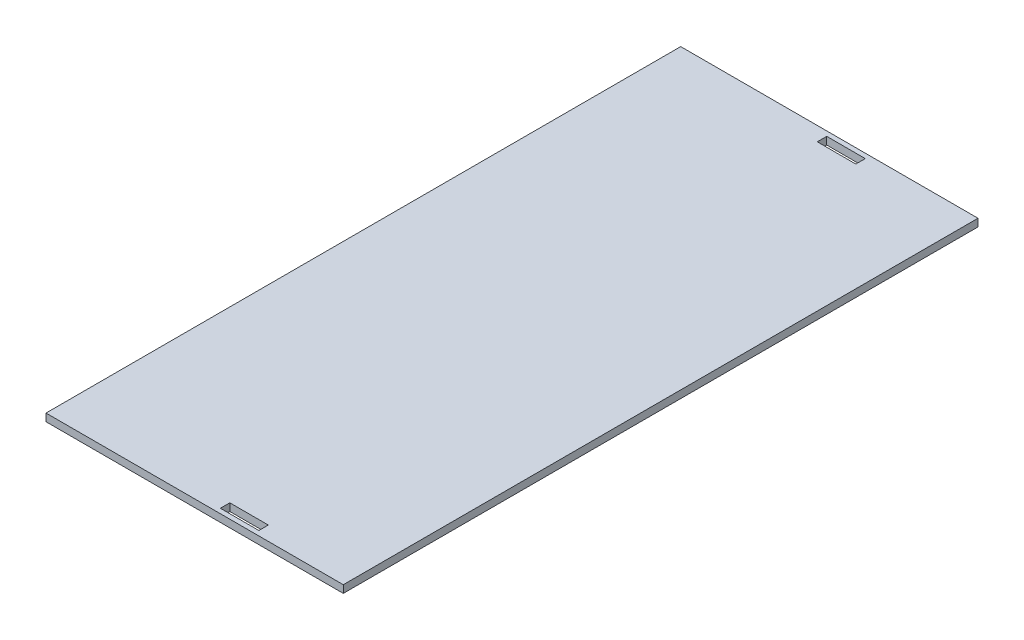
ISO-10303-21;
HEADER;
FILE_DESCRIPTION(('STEP AP214'),'2;1');
FILE_NAME('part.step','',(''),(''),'','','');
FILE_SCHEMA(('AUTOMOTIVE_DESIGN { 1 0 10303 214 1 1 1 1 }'));
ENDSEC;
DATA;
#1=APPLICATION_CONTEXT('core data for automotive mechanical design processes');
#2=APPLICATION_PROTOCOL_DEFINITION('international standard','automotive_design',2000,#1);
#3=PRODUCT_CONTEXT('',#1,'mechanical');
#4=PRODUCT('Part','Part','',(#3));
#5=PRODUCT_RELATED_PRODUCT_CATEGORY('part','',(#4));
#6=PRODUCT_DEFINITION_FORMATION('','',#4);
#7=PRODUCT_DEFINITION_CONTEXT('part definition',#1,'design');
#8=PRODUCT_DEFINITION('design','',#6,#7);
#9=PRODUCT_DEFINITION_SHAPE('','',#8);
#10=(LENGTH_UNIT() NAMED_UNIT(*) SI_UNIT(.MILLI.,.METRE.));
#11=(NAMED_UNIT(*) PLANE_ANGLE_UNIT() SI_UNIT($,.RADIAN.));
#12=(NAMED_UNIT(*) SI_UNIT($,.STERADIAN.) SOLID_ANGLE_UNIT());
#13=UNCERTAINTY_MEASURE_WITH_UNIT(LENGTH_MEASURE(1.E-05),#10,'distance_accuracy_value','');
#14=(GEOMETRIC_REPRESENTATION_CONTEXT(3) GLOBAL_UNCERTAINTY_ASSIGNED_CONTEXT((#13)) GLOBAL_UNIT_ASSIGNED_CONTEXT((#10,
#11,#12)) REPRESENTATION_CONTEXT('',''));
#15=CARTESIAN_POINT('',(0.,0.,0.));
#16=DIRECTION('',(0.,0.,1.));
#17=DIRECTION('',(1.,0.,0.));
#18=AXIS2_PLACEMENT_3D('',#15,#16,#17);
#19=CARTESIAN_POINT('',(39.345,2.,-84.));
#20=DIRECTION('',(-1.,0.,0.));
#21=DIRECTION('',(0.,0.,1.));
#22=AXIS2_PLACEMENT_3D('',#19,#20,#21);
#23=PLANE('',#22);
#24=DIRECTION('',(0.,0.,-1.));
#25=VECTOR('',#24,1.);
#26=CARTESIAN_POINT('',(39.345,0.,-84.));
#27=LINE('',#26,#25);
#28=CARTESIAN_POINT('',(39.345,0.,84.));
#29=VERTEX_POINT('',#28);
#30=CARTESIAN_POINT('',(39.345,0.,-84.));
#31=VERTEX_POINT('',#30);
#32=EDGE_CURVE('E195',#29,#31,#27,.T.);
#33=ORIENTED_EDGE('',*,*,#32,.T.);
#34=DIRECTION('',(0.,-1.,0.));
#35=VECTOR('',#34,1.);
#36=CARTESIAN_POINT('',(39.345,2.,-84.));
#37=LINE('',#36,#35);
#38=CARTESIAN_POINT('',(39.345,2.,-84.));
#39=VERTEX_POINT('',#38);
#40=EDGE_CURVE('E242',#39,#31,#37,.T.);
#41=ORIENTED_EDGE('',*,*,#40,.F.);
#42=DIRECTION('',(0.,0.,-1.));
#43=VECTOR('',#42,1.);
#44=CARTESIAN_POINT('',(39.345,2.,-84.));
#45=LINE('',#44,#43);
#46=CARTESIAN_POINT('',(39.345,2.,84.));
#47=VERTEX_POINT('',#46);
#48=EDGE_CURVE('E205',#47,#39,#45,.T.);
#49=ORIENTED_EDGE('',*,*,#48,.F.);
#50=DIRECTION('',(0.,-1.,0.));
#51=VECTOR('',#50,1.);
#52=CARTESIAN_POINT('',(39.345,2.,84.));
#53=LINE('',#52,#51);
#54=EDGE_CURVE('E219',#47,#29,#53,.T.);
#55=ORIENTED_EDGE('',*,*,#54,.T.);
#56=EDGE_LOOP('',(#33,#41,#49,#55));
#57=FACE_BOUND('',#56,.T.);
#58=ADVANCED_FACE('F39',(#57),#23,.F.);
#59=CARTESIAN_POINT('',(-39.345,2.,-84.));
#60=DIRECTION('',(0.,0.,1.));
#61=DIRECTION('',(1.,0.,0.));
#62=AXIS2_PLACEMENT_3D('',#59,#60,#61);
#63=PLANE('',#62);
#64=DIRECTION('',(-1.,0.,0.));
#65=VECTOR('',#64,1.);
#66=CARTESIAN_POINT('',(-39.345,0.,-84.));
#67=LINE('',#66,#65);
#68=CARTESIAN_POINT('',(-39.345,0.,-84.));
#69=VERTEX_POINT('',#68);
#70=EDGE_CURVE('E223',#31,#69,#67,.T.);
#71=ORIENTED_EDGE('',*,*,#70,.T.);
#72=DIRECTION('',(0.,-1.,0.));
#73=VECTOR('',#72,1.);
#74=CARTESIAN_POINT('',(-39.345,2.,-84.));
#75=LINE('',#74,#73);
#76=CARTESIAN_POINT('',(-39.345,2.,-84.));
#77=VERTEX_POINT('',#76);
#78=EDGE_CURVE('E238',#77,#69,#75,.T.);
#79=ORIENTED_EDGE('',*,*,#78,.F.);
#80=DIRECTION('',(-1.,0.,0.));
#81=VECTOR('',#80,1.);
#82=CARTESIAN_POINT('',(-39.345,2.,-84.));
#83=LINE('',#82,#81);
#84=EDGE_CURVE('E209',#39,#77,#83,.T.);
#85=ORIENTED_EDGE('',*,*,#84,.F.);
#86=ORIENTED_EDGE('',*,*,#40,.T.);
#87=EDGE_LOOP('',(#71,#79,#85,#86));
#88=FACE_BOUND('',#87,.T.);
#89=ADVANCED_FACE('F286',(#88),#63,.F.);
#90=CARTESIAN_POINT('',(-39.345,2.,-84.));
#91=DIRECTION('',(1.,0.,0.));
#92=DIRECTION('',(0.,0.,-1.));
#93=AXIS2_PLACEMENT_3D('',#90,#91,#92);
#94=PLANE('',#93);
#95=DIRECTION('',(0.,0.,1.));
#96=VECTOR('',#95,1.);
#97=CARTESIAN_POINT('',(-39.345,0.,-84.));
#98=LINE('',#97,#96);
#99=CARTESIAN_POINT('',(-39.345,0.,84.));
#100=VERTEX_POINT('',#99);
#101=EDGE_CURVE('E226',#69,#100,#98,.T.);
#102=ORIENTED_EDGE('',*,*,#101,.T.);
#103=DIRECTION('',(0.,-1.,0.));
#104=VECTOR('',#103,1.);
#105=CARTESIAN_POINT('',(-39.345,2.,84.));
#106=LINE('',#105,#104);
#107=CARTESIAN_POINT('',(-39.345,2.,84.));
#108=VERTEX_POINT('',#107);
#109=EDGE_CURVE('E234',#108,#100,#106,.T.);
#110=ORIENTED_EDGE('',*,*,#109,.F.);
#111=DIRECTION('',(0.,0.,1.));
#112=VECTOR('',#111,1.);
#113=CARTESIAN_POINT('',(-39.345,2.,-84.));
#114=LINE('',#113,#112);
#115=EDGE_CURVE('E213',#77,#108,#114,.T.);
#116=ORIENTED_EDGE('',*,*,#115,.F.);
#117=ORIENTED_EDGE('',*,*,#78,.T.);
#118=EDGE_LOOP('',(#102,#110,#116,#117));
#119=FACE_BOUND('',#118,.T.);
#120=ADVANCED_FACE('F291',(#119),#94,.F.);
#121=CARTESIAN_POINT('',(-39.345,2.,84.));
#122=DIRECTION('',(0.,0.,-1.));
#123=DIRECTION('',(-1.,0.,0.));
#124=AXIS2_PLACEMENT_3D('',#121,#122,#123);
#125=PLANE('',#124);
#126=DIRECTION('',(1.,0.,0.));
#127=VECTOR('',#126,1.);
#128=CARTESIAN_POINT('',(-39.345,0.,84.));
#129=LINE('',#128,#127);
#130=EDGE_CURVE('E210',#100,#29,#129,.T.);
#131=ORIENTED_EDGE('',*,*,#130,.T.);
#132=ORIENTED_EDGE('',*,*,#54,.F.);
#133=DIRECTION('',(1.,0.,0.));
#134=VECTOR('',#133,1.);
#135=CARTESIAN_POINT('',(-39.345,2.,84.));
#136=LINE('',#135,#134);
#137=EDGE_CURVE('E216',#108,#47,#136,.T.);
#138=ORIENTED_EDGE('',*,*,#137,.F.);
#139=ORIENTED_EDGE('',*,*,#109,.T.);
#140=EDGE_LOOP('',(#131,#132,#138,#139));
#141=FACE_BOUND('',#140,.T.);
#142=ADVANCED_FACE('F304',(#141),#125,.F.);
#143=CARTESIAN_POINT('',(0.,2.,0.));
#144=DIRECTION('',(0.,1.,0.));
#145=DIRECTION('',(0.,0.,1.));
#146=AXIS2_PLACEMENT_3D('',#143,#144,#145);
#147=PLANE('',#146);
#148=DIRECTION('',(0.,0.,1.));
#149=VECTOR('',#148,1.);
#150=CARTESIAN_POINT('',(5.55116,2.,82.75));
#151=LINE('',#150,#149);
#152=CARTESIAN_POINT('',(5.55116,2.,80.25));
#153=VERTEX_POINT('',#152);
#154=CARTESIAN_POINT('',(5.55116,2.,82.75));
#155=VERTEX_POINT('',#154);
#156=EDGE_CURVE('E54',#153,#155,#151,.T.);
#157=ORIENTED_EDGE('',*,*,#156,.F.);
#158=DIRECTION('',(-1.,0.,0.));
#159=VECTOR('',#158,1.);
#160=CARTESIAN_POINT('',(5.55116,2.,80.25));
#161=LINE('',#160,#159);
#162=CARTESIAN_POINT('',(15.75116,2.,80.25));
#163=VERTEX_POINT('',#162);
#164=EDGE_CURVE('E149',#163,#153,#161,.T.);
#165=ORIENTED_EDGE('',*,*,#164,.F.);
#166=DIRECTION('',(0.,0.,-1.));
#167=VECTOR('',#166,1.);
#168=CARTESIAN_POINT('',(15.75116,2.,82.75));
#169=LINE('',#168,#167);
#170=CARTESIAN_POINT('',(15.75116,2.,82.75));
#171=VERTEX_POINT('',#170);
#172=EDGE_CURVE('E153',#171,#163,#169,.T.);
#173=ORIENTED_EDGE('',*,*,#172,.F.);
#174=DIRECTION('',(1.,0.,0.));
#175=VECTOR('',#174,1.);
#176=CARTESIAN_POINT('',(5.55116,2.,82.75));
#177=LINE('',#176,#175);
#178=EDGE_CURVE('E162',#155,#171,#177,.T.);
#179=ORIENTED_EDGE('',*,*,#178,.F.);
#180=EDGE_LOOP('',(#157,#165,#173,#179));
#181=FACE_BOUND('',#180,.T.);
#182=DIRECTION('',(0.,0.,1.));
#183=VECTOR('',#182,1.);
#184=CARTESIAN_POINT('',(0.554999999999993,2.,-82.75));
#185=LINE('',#184,#183);
#186=CARTESIAN_POINT('',(0.554999999999993,2.,-82.75));
#187=VERTEX_POINT('',#186);
#188=CARTESIAN_POINT('',(0.554999999999993,2.,-80.25));
#189=VERTEX_POINT('',#188);
#190=EDGE_CURVE('E171',#187,#189,#185,.T.);
#191=ORIENTED_EDGE('',*,*,#190,.F.);
#192=DIRECTION('',(-1.,0.,0.));
#193=VECTOR('',#192,1.);
#194=CARTESIAN_POINT('',(10.755,2.,-82.75));
#195=LINE('',#194,#193);
#196=CARTESIAN_POINT('',(10.755,2.,-82.75));
#197=VERTEX_POINT('',#196);
#198=EDGE_CURVE('E187',#197,#187,#195,.T.);
#199=ORIENTED_EDGE('',*,*,#198,.F.);
#200=DIRECTION('',(0.,0.,-1.));
#201=VECTOR('',#200,1.);
#202=CARTESIAN_POINT('',(10.755,2.,-82.75));
#203=LINE('',#202,#201);
#204=CARTESIAN_POINT('',(10.755,2.,-80.25));
#205=VERTEX_POINT('',#204);
#206=EDGE_CURVE('E183',#205,#197,#203,.T.);
#207=ORIENTED_EDGE('',*,*,#206,.F.);
#208=DIRECTION('',(1.,0.,0.));
#209=VECTOR('',#208,1.);
#210=CARTESIAN_POINT('',(10.755,2.,-80.25));
#211=LINE('',#210,#209);
#212=EDGE_CURVE('E179',#189,#205,#211,.T.);
#213=ORIENTED_EDGE('',*,*,#212,.F.);
#214=EDGE_LOOP('',(#191,#199,#207,#213));
#215=FACE_BOUND('',#214,.T.);
#216=ORIENTED_EDGE('',*,*,#48,.T.);
#217=ORIENTED_EDGE('',*,*,#84,.T.);
#218=ORIENTED_EDGE('',*,*,#115,.T.);
#219=ORIENTED_EDGE('',*,*,#137,.T.);
#220=EDGE_LOOP('',(#216,#217,#218,#219));
#221=FACE_BOUND('',#220,.T.);
#222=ADVANCED_FACE('F268',(#181,#215,#221),#147,.T.);
#223=CARTESIAN_POINT('',(0.,0.,0.));
#224=DIRECTION('',(0.,1.,0.));
#225=DIRECTION('',(0.,0.,1.));
#226=AXIS2_PLACEMENT_3D('',#223,#224,#225);
#227=PLANE('',#226);
#228=DIRECTION('',(-1.,0.,0.));
#229=VECTOR('',#228,1.);
#230=CARTESIAN_POINT('',(5.55116,0.,80.25));
#231=LINE('',#230,#229);
#232=CARTESIAN_POINT('',(15.75116,0.,80.25));
#233=VERTEX_POINT('',#232);
#234=CARTESIAN_POINT('',(5.55116,0.,80.25));
#235=VERTEX_POINT('',#234);
#236=EDGE_CURVE('E137',#233,#235,#231,.T.);
#237=ORIENTED_EDGE('',*,*,#236,.T.);
#238=DIRECTION('',(0.,0.,1.));
#239=VECTOR('',#238,1.);
#240=CARTESIAN_POINT('',(5.55116,0.,82.75));
#241=LINE('',#240,#239);
#242=CARTESIAN_POINT('',(5.55116,0.,82.75));
#243=VERTEX_POINT('',#242);
#244=EDGE_CURVE('E130',#235,#243,#241,.T.);
#245=ORIENTED_EDGE('',*,*,#244,.T.);
#246=DIRECTION('',(1.,0.,0.));
#247=VECTOR('',#246,1.);
#248=CARTESIAN_POINT('',(5.55116,0.,82.75));
#249=LINE('',#248,#247);
#250=CARTESIAN_POINT('',(15.75116,0.,82.75));
#251=VERTEX_POINT('',#250);
#252=EDGE_CURVE('E140',#243,#251,#249,.T.);
#253=ORIENTED_EDGE('',*,*,#252,.T.);
#254=DIRECTION('',(0.,0.,-1.));
#255=VECTOR('',#254,1.);
#256=CARTESIAN_POINT('',(15.75116,0.,82.75));
#257=LINE('',#256,#255);
#258=EDGE_CURVE('E62',#251,#233,#257,.T.);
#259=ORIENTED_EDGE('',*,*,#258,.T.);
#260=EDGE_LOOP('',(#237,#245,#253,#259));
#261=FACE_BOUND('',#260,.T.);
#262=DIRECTION('',(-1.,0.,0.));
#263=VECTOR('',#262,1.);
#264=CARTESIAN_POINT('',(0.,0.,-82.75));
#265=LINE('',#264,#263);
#266=CARTESIAN_POINT('',(10.755,0.,-82.75));
#267=VERTEX_POINT('',#266);
#268=CARTESIAN_POINT('',(0.554999999999993,0.,-82.75));
#269=VERTEX_POINT('',#268);
#270=EDGE_CURVE('E47',#267,#269,#265,.T.);
#271=ORIENTED_EDGE('',*,*,#270,.T.);
#272=DIRECTION('',(0.,0.,1.));
#273=VECTOR('',#272,1.);
#274=CARTESIAN_POINT('',(0.555000000000007,0.,0.));
#275=LINE('',#274,#273);
#276=CARTESIAN_POINT('',(0.554999999999993,0.,-80.25));
#277=VERTEX_POINT('',#276);
#278=EDGE_CURVE('E11',#269,#277,#275,.T.);
#279=ORIENTED_EDGE('',*,*,#278,.T.);
#280=DIRECTION('',(1.,0.,0.));
#281=VECTOR('',#280,1.);
#282=CARTESIAN_POINT('',(0.,0.,-80.25));
#283=LINE('',#282,#281);
#284=CARTESIAN_POINT('',(10.755,0.,-80.25));
#285=VERTEX_POINT('',#284);
#286=EDGE_CURVE('E246',#277,#285,#283,.T.);
#287=ORIENTED_EDGE('',*,*,#286,.T.);
#288=DIRECTION('',(0.,0.,-1.));
#289=VECTOR('',#288,1.);
#290=CARTESIAN_POINT('',(10.755,0.,0.));
#291=LINE('',#290,#289);
#292=EDGE_CURVE('E250',#285,#267,#291,.T.);
#293=ORIENTED_EDGE('',*,*,#292,.T.);
#294=EDGE_LOOP('',(#271,#279,#287,#293));
#295=FACE_BOUND('',#294,.T.);
#296=ORIENTED_EDGE('',*,*,#32,.F.);
#297=ORIENTED_EDGE('',*,*,#130,.F.);
#298=ORIENTED_EDGE('',*,*,#101,.F.);
#299=ORIENTED_EDGE('',*,*,#70,.F.);
#300=EDGE_LOOP('',(#296,#297,#298,#299));
#301=FACE_BOUND('',#300,.T.);
#302=ADVANCED_FACE('F145',(#261,#295,#301),#227,.F.);
#303=CARTESIAN_POINT('',(0.554999999999993,-3.,-82.75));
#304=DIRECTION('',(-1.,0.,0.));
#305=DIRECTION('',(0.,0.,1.));
#306=AXIS2_PLACEMENT_3D('',#303,#304,#305);
#307=PLANE('',#306);
#308=DIRECTION('',(0.,1.,0.));
#309=VECTOR('',#308,1.);
#310=CARTESIAN_POINT('',(0.554999999999993,-3.,-82.75));
#311=LINE('',#310,#309);
#312=EDGE_CURVE('E192',#269,#187,#311,.T.);
#313=ORIENTED_EDGE('',*,*,#312,.T.);
#314=ORIENTED_EDGE('',*,*,#190,.T.);
#315=DIRECTION('',(0.,1.,0.));
#316=VECTOR('',#315,1.);
#317=CARTESIAN_POINT('',(0.554999999999993,-3.,-80.25));
#318=LINE('',#317,#316);
#319=EDGE_CURVE('E191',#277,#189,#318,.T.);
#320=ORIENTED_EDGE('',*,*,#319,.F.);
#321=ORIENTED_EDGE('',*,*,#278,.F.);
#322=EDGE_LOOP('',(#313,#314,#320,#321));
#323=FACE_BOUND('',#322,.T.);
#324=ADVANCED_FACE('F272',(#323),#307,.F.);
#325=CARTESIAN_POINT('',(10.755,-3.,-82.75));
#326=DIRECTION('',(0.,0.,-1.));
#327=DIRECTION('',(-1.,0.,0.));
#328=AXIS2_PLACEMENT_3D('',#325,#326,#327);
#329=PLANE('',#328);
#330=DIRECTION('',(0.,1.,0.));
#331=VECTOR('',#330,1.);
#332=CARTESIAN_POINT('',(10.755,-3.,-82.75));
#333=LINE('',#332,#331);
#334=EDGE_CURVE('E196',#267,#197,#333,.T.);
#335=ORIENTED_EDGE('',*,*,#334,.T.);
#336=ORIENTED_EDGE('',*,*,#198,.T.);
#337=ORIENTED_EDGE('',*,*,#312,.F.);
#338=ORIENTED_EDGE('',*,*,#270,.F.);
#339=EDGE_LOOP('',(#335,#336,#337,#338));
#340=FACE_BOUND('',#339,.T.);
#341=ADVANCED_FACE('F260',(#340),#329,.F.);
#342=CARTESIAN_POINT('',(10.755,-3.,-82.75));
#343=DIRECTION('',(1.,0.,0.));
#344=DIRECTION('',(0.,0.,-1.));
#345=AXIS2_PLACEMENT_3D('',#342,#343,#344);
#346=PLANE('',#345);
#347=DIRECTION('',(0.,1.,0.));
#348=VECTOR('',#347,1.);
#349=CARTESIAN_POINT('',(10.755,-3.,-80.25));
#350=LINE('',#349,#348);
#351=EDGE_CURVE('E199',#285,#205,#350,.T.);
#352=ORIENTED_EDGE('',*,*,#351,.T.);
#353=ORIENTED_EDGE('',*,*,#206,.T.);
#354=ORIENTED_EDGE('',*,*,#334,.F.);
#355=ORIENTED_EDGE('',*,*,#292,.F.);
#356=EDGE_LOOP('',(#352,#353,#354,#355));
#357=FACE_BOUND('',#356,.T.);
#358=ADVANCED_FACE('F262',(#357),#346,.F.);
#359=CARTESIAN_POINT('',(10.755,-3.,-80.25));
#360=DIRECTION('',(0.,0.,1.));
#361=DIRECTION('',(1.,0.,0.));
#362=AXIS2_PLACEMENT_3D('',#359,#360,#361);
#363=PLANE('',#362);
#364=ORIENTED_EDGE('',*,*,#319,.T.);
#365=ORIENTED_EDGE('',*,*,#212,.T.);
#366=ORIENTED_EDGE('',*,*,#351,.F.);
#367=ORIENTED_EDGE('',*,*,#286,.F.);
#368=EDGE_LOOP('',(#364,#365,#366,#367));
#369=FACE_BOUND('',#368,.T.);
#370=ADVANCED_FACE('F274',(#369),#363,.F.);
#371=CARTESIAN_POINT('',(5.55116,0.,82.75));
#372=DIRECTION('',(-1.,0.,0.));
#373=DIRECTION('',(0.,0.,1.));
#374=AXIS2_PLACEMENT_3D('',#371,#372,#373);
#375=PLANE('',#374);
#376=ORIENTED_EDGE('',*,*,#156,.T.);
#377=DIRECTION('',(0.,1.,0.));
#378=VECTOR('',#377,1.);
#379=CARTESIAN_POINT('',(5.55116,0.,82.75));
#380=LINE('',#379,#378);
#381=EDGE_CURVE('E126',#243,#155,#380,.T.);
#382=ORIENTED_EDGE('',*,*,#381,.F.);
#383=ORIENTED_EDGE('',*,*,#244,.F.);
#384=DIRECTION('',(0.,1.,0.));
#385=VECTOR('',#384,1.);
#386=CARTESIAN_POINT('',(5.55116,0.,80.25));
#387=LINE('',#386,#385);
#388=EDGE_CURVE('E168',#235,#153,#387,.T.);
#389=ORIENTED_EDGE('',*,*,#388,.T.);
#390=EDGE_LOOP('',(#376,#382,#383,#389));
#391=FACE_BOUND('',#390,.T.);
#392=ADVANCED_FACE('F128',(#391),#375,.F.);
#393=CARTESIAN_POINT('',(5.55116,0.,80.25));
#394=DIRECTION('',(0.,0.,-1.));
#395=DIRECTION('',(-1.,0.,0.));
#396=AXIS2_PLACEMENT_3D('',#393,#394,#395);
#397=PLANE('',#396);
#398=ORIENTED_EDGE('',*,*,#164,.T.);
#399=ORIENTED_EDGE('',*,*,#388,.F.);
#400=ORIENTED_EDGE('',*,*,#236,.F.);
#401=DIRECTION('',(0.,1.,0.));
#402=VECTOR('',#401,1.);
#403=CARTESIAN_POINT('',(15.75116,0.,80.25));
#404=LINE('',#403,#402);
#405=EDGE_CURVE('E172',#233,#163,#404,.T.);
#406=ORIENTED_EDGE('',*,*,#405,.T.);
#407=EDGE_LOOP('',(#398,#399,#400,#406));
#408=FACE_BOUND('',#407,.T.);
#409=ADVANCED_FACE('F281',(#408),#397,.F.);
#410=CARTESIAN_POINT('',(15.75116,0.,82.75));
#411=DIRECTION('',(1.,0.,0.));
#412=DIRECTION('',(0.,0.,-1.));
#413=AXIS2_PLACEMENT_3D('',#410,#411,#412);
#414=PLANE('',#413);
#415=ORIENTED_EDGE('',*,*,#172,.T.);
#416=ORIENTED_EDGE('',*,*,#405,.F.);
#417=ORIENTED_EDGE('',*,*,#258,.F.);
#418=DIRECTION('',(0.,1.,0.));
#419=VECTOR('',#418,1.);
#420=CARTESIAN_POINT('',(15.75116,0.,82.75));
#421=LINE('',#420,#419);
#422=EDGE_CURVE('E136',#251,#171,#421,.T.);
#423=ORIENTED_EDGE('',*,*,#422,.T.);
#424=EDGE_LOOP('',(#415,#416,#417,#423));
#425=FACE_BOUND('',#424,.T.);
#426=ADVANCED_FACE('F327',(#425),#414,.F.);
#427=CARTESIAN_POINT('',(5.55116,0.,82.75));
#428=DIRECTION('',(0.,0.,1.));
#429=DIRECTION('',(1.,0.,0.));
#430=AXIS2_PLACEMENT_3D('',#427,#428,#429);
#431=PLANE('',#430);
#432=ORIENTED_EDGE('',*,*,#178,.T.);
#433=ORIENTED_EDGE('',*,*,#422,.F.);
#434=ORIENTED_EDGE('',*,*,#252,.F.);
#435=ORIENTED_EDGE('',*,*,#381,.T.);
#436=EDGE_LOOP('',(#432,#433,#434,#435));
#437=FACE_BOUND('',#436,.T.);
#438=ADVANCED_FACE('F141',(#437),#431,.F.);
#439=CLOSED_SHELL('',(#58,#89,#120,#142,#222,#302,#324,#341,#358,#370,#392,#409,#426,#438));
#440=MANIFOLD_SOLID_BREP('B2',#439);
#441=ADVANCED_BREP_SHAPE_REPRESENTATION('',(#18,#440),#14);
#442=SHAPE_DEFINITION_REPRESENTATION(#9,#441);
ENDSEC;
END-ISO-10303-21;
